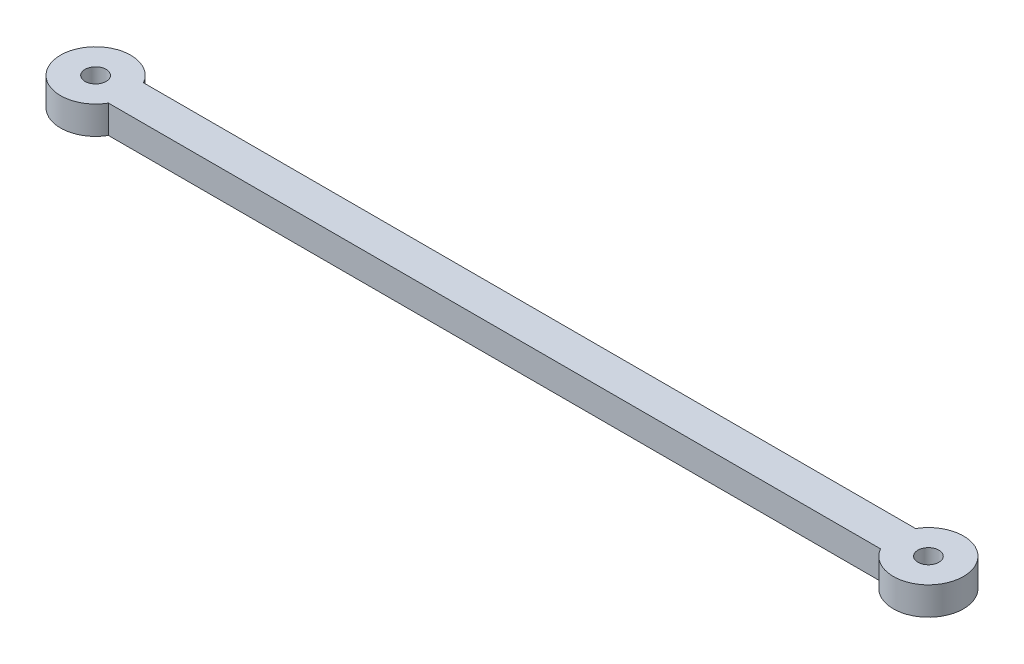
ISO-10303-21;
HEADER;
FILE_DESCRIPTION(('STEP AP214'),'2;1');
FILE_NAME('part.step','',(''),(''),'','','');
FILE_SCHEMA(('AUTOMOTIVE_DESIGN { 1 0 10303 214 1 1 1 1 }'));
ENDSEC;
DATA;
#1=APPLICATION_CONTEXT('core data for automotive mechanical design processes');
#2=APPLICATION_PROTOCOL_DEFINITION('international standard','automotive_design',2000,#1);
#3=PRODUCT_CONTEXT('',#1,'mechanical');
#4=PRODUCT('Part','Part','',(#3));
#5=PRODUCT_RELATED_PRODUCT_CATEGORY('part','',(#4));
#6=PRODUCT_DEFINITION_FORMATION('','',#4);
#7=PRODUCT_DEFINITION_CONTEXT('part definition',#1,'design');
#8=PRODUCT_DEFINITION('design','',#6,#7);
#9=PRODUCT_DEFINITION_SHAPE('','',#8);
#10=(LENGTH_UNIT() NAMED_UNIT(*) SI_UNIT(.MILLI.,.METRE.));
#11=(NAMED_UNIT(*) PLANE_ANGLE_UNIT() SI_UNIT($,.RADIAN.));
#12=(NAMED_UNIT(*) SI_UNIT($,.STERADIAN.) SOLID_ANGLE_UNIT());
#13=UNCERTAINTY_MEASURE_WITH_UNIT(LENGTH_MEASURE(1.E-05),#10,'distance_accuracy_value','');
#14=(GEOMETRIC_REPRESENTATION_CONTEXT(3) GLOBAL_UNCERTAINTY_ASSIGNED_CONTEXT((#13)) GLOBAL_UNIT_ASSIGNED_CONTEXT((#10,
#11,#12)) REPRESENTATION_CONTEXT('',''));
#15=CARTESIAN_POINT('',(0.,0.,0.));
#16=DIRECTION('',(0.,0.,1.));
#17=DIRECTION('',(1.,0.,0.));
#18=AXIS2_PLACEMENT_3D('',#15,#16,#17);
#19=CARTESIAN_POINT('',(-59.3301270189222,4.,0.));
#20=DIRECTION('',(0.,-1.,0.));
#21=DIRECTION('',(0.,0.,-1.));
#22=AXIS2_PLACEMENT_3D('',#19,#20,#21);
#23=CYLINDRICAL_SURFACE('',#22,5.);
#24=CARTESIAN_POINT('',(-59.3301270189222,0.,0.));
#25=DIRECTION('',(0.,1.,0.));
#26=DIRECTION('',(0.,0.,1.));
#27=AXIS2_PLACEMENT_3D('',#24,#25,#26);
#28=CIRCLE('',#27,5.);
#29=CARTESIAN_POINT('',(-55.,0.,-2.5));
#30=VERTEX_POINT('',#29);
#31=CARTESIAN_POINT('',(-55.,0.,2.5));
#32=VERTEX_POINT('',#31);
#33=EDGE_CURVE('E96',#30,#32,#28,.T.);
#34=ORIENTED_EDGE('',*,*,#33,.T.);
#35=DIRECTION('',(0.,-1.,0.));
#36=VECTOR('',#35,1.);
#37=CARTESIAN_POINT('',(-55.,4.,2.5));
#38=LINE('',#37,#36);
#39=CARTESIAN_POINT('',(-55.,4.,2.5));
#40=VERTEX_POINT('',#39);
#41=EDGE_CURVE('E11',#40,#32,#38,.T.);
#42=ORIENTED_EDGE('',*,*,#41,.F.);
#43=CARTESIAN_POINT('',(-59.3301270189222,4.,0.));
#44=DIRECTION('',(0.,1.,0.));
#45=DIRECTION('',(0.,0.,1.));
#46=AXIS2_PLACEMENT_3D('',#43,#44,#45);
#47=CIRCLE('',#46,5.);
#48=CARTESIAN_POINT('',(-55.,4.,-2.5));
#49=VERTEX_POINT('',#48);
#50=EDGE_CURVE('E84',#49,#40,#47,.T.);
#51=ORIENTED_EDGE('',*,*,#50,.F.);
#52=DIRECTION('',(0.,-1.,0.));
#53=VECTOR('',#52,1.);
#54=CARTESIAN_POINT('',(-55.,4.,-2.5));
#55=LINE('',#54,#53);
#56=EDGE_CURVE('E92',#49,#30,#55,.T.);
#57=ORIENTED_EDGE('',*,*,#56,.T.);
#58=EDGE_LOOP('',(#34,#42,#51,#57));
#59=FACE_BOUND('',#58,.T.);
#60=ADVANCED_FACE('F33',(#59),#23,.T.);
#61=CARTESIAN_POINT('',(-55.,4.,2.5));
#62=DIRECTION('',(0.,0.,-1.));
#63=DIRECTION('',(-1.,0.,0.));
#64=AXIS2_PLACEMENT_3D('',#61,#62,#63);
#65=PLANE('',#64);
#66=DIRECTION('',(1.,0.,0.));
#67=VECTOR('',#66,1.);
#68=CARTESIAN_POINT('',(-55.,0.,2.5));
#69=LINE('',#68,#67);
#70=CARTESIAN_POINT('',(55.,0.,2.50000000000001));
#71=VERTEX_POINT('',#70);
#72=EDGE_CURVE('E88',#32,#71,#69,.T.);
#73=ORIENTED_EDGE('',*,*,#72,.T.);
#74=DIRECTION('',(0.,-1.,0.));
#75=VECTOR('',#74,1.);
#76=CARTESIAN_POINT('',(55.,4.,2.50000000000001));
#77=LINE('',#76,#75);
#78=CARTESIAN_POINT('',(55.,4.,2.50000000000001));
#79=VERTEX_POINT('',#78);
#80=EDGE_CURVE('E41',#79,#71,#77,.T.);
#81=ORIENTED_EDGE('',*,*,#80,.F.);
#82=DIRECTION('',(1.,0.,0.));
#83=VECTOR('',#82,1.);
#84=CARTESIAN_POINT('',(-55.,4.,2.5));
#85=LINE('',#84,#83);
#86=EDGE_CURVE('E79',#40,#79,#85,.T.);
#87=ORIENTED_EDGE('',*,*,#86,.F.);
#88=ORIENTED_EDGE('',*,*,#41,.T.);
#89=EDGE_LOOP('',(#73,#81,#87,#88));
#90=FACE_BOUND('',#89,.T.);
#91=ADVANCED_FACE('F87',(#90),#65,.F.);
#92=CARTESIAN_POINT('',(59.3301270189222,4.,0.));
#93=DIRECTION('',(0.,-1.,0.));
#94=DIRECTION('',(0.,0.,-1.));
#95=AXIS2_PLACEMENT_3D('',#92,#93,#94);
#96=CYLINDRICAL_SURFACE('',#95,5.);
#97=CARTESIAN_POINT('',(59.3301270189222,0.,0.));
#98=DIRECTION('',(0.,1.,0.));
#99=DIRECTION('',(0.,0.,-1.));
#100=AXIS2_PLACEMENT_3D('',#97,#98,#99);
#101=CIRCLE('',#100,5.);
#102=CARTESIAN_POINT('',(55.,0.,-2.5));
#103=VERTEX_POINT('',#102);
#104=EDGE_CURVE('E66',#71,#103,#101,.T.);
#105=ORIENTED_EDGE('',*,*,#104,.T.);
#106=DIRECTION('',(0.,-1.,0.));
#107=VECTOR('',#106,1.);
#108=CARTESIAN_POINT('',(55.,4.,-2.5));
#109=LINE('',#108,#107);
#110=CARTESIAN_POINT('',(55.,4.,-2.5));
#111=VERTEX_POINT('',#110);
#112=EDGE_CURVE('E89',#111,#103,#109,.T.);
#113=ORIENTED_EDGE('',*,*,#112,.F.);
#114=CARTESIAN_POINT('',(59.3301270189222,4.,0.));
#115=DIRECTION('',(0.,1.,0.));
#116=DIRECTION('',(0.,0.,-1.));
#117=AXIS2_PLACEMENT_3D('',#114,#115,#116);
#118=CIRCLE('',#117,5.);
#119=EDGE_CURVE('E82',#79,#111,#118,.T.);
#120=ORIENTED_EDGE('',*,*,#119,.F.);
#121=ORIENTED_EDGE('',*,*,#80,.T.);
#122=EDGE_LOOP('',(#105,#113,#120,#121));
#123=FACE_BOUND('',#122,.T.);
#124=ADVANCED_FACE('F90',(#123),#96,.T.);
#125=CARTESIAN_POINT('',(-55.,4.,-2.5));
#126=DIRECTION('',(0.,0.,1.));
#127=DIRECTION('',(1.,0.,0.));
#128=AXIS2_PLACEMENT_3D('',#125,#126,#127);
#129=PLANE('',#128);
#130=DIRECTION('',(-1.,0.,0.));
#131=VECTOR('',#130,1.);
#132=CARTESIAN_POINT('',(-55.,0.,-2.5));
#133=LINE('',#132,#131);
#134=EDGE_CURVE('E72',#103,#30,#133,.T.);
#135=ORIENTED_EDGE('',*,*,#134,.T.);
#136=ORIENTED_EDGE('',*,*,#56,.F.);
#137=DIRECTION('',(-1.,0.,0.));
#138=VECTOR('',#137,1.);
#139=CARTESIAN_POINT('',(-55.,4.,-2.5));
#140=LINE('',#139,#138);
#141=EDGE_CURVE('E49',#111,#49,#140,.T.);
#142=ORIENTED_EDGE('',*,*,#141,.F.);
#143=ORIENTED_EDGE('',*,*,#112,.T.);
#144=EDGE_LOOP('',(#135,#136,#142,#143));
#145=FACE_BOUND('',#144,.T.);
#146=ADVANCED_FACE('F104',(#145),#129,.F.);
#147=CARTESIAN_POINT('',(-59.3301270189222,4.,0.));
#148=DIRECTION('',(0.,1.,0.));
#149=DIRECTION('',(0.,0.,1.));
#150=AXIS2_PLACEMENT_3D('',#147,#148,#149);
#151=PLANE('',#150);
#152=CARTESIAN_POINT('',(-59.3301270189222,4.,0.));
#153=DIRECTION('',(0.,1.,0.));
#154=DIRECTION('',(0.,0.,1.));
#155=AXIS2_PLACEMENT_3D('',#152,#153,#154);
#156=CIRCLE('',#155,1.5);
#157=CARTESIAN_POINT('',(-59.3301270189222,4.,1.5));
#158=VERTEX_POINT('',#157);
#159=EDGE_CURVE('E116',#158,#158,#156,.T.);
#160=ORIENTED_EDGE('',*,*,#159,.F.);
#161=EDGE_LOOP('',(#160));
#162=FACE_BOUND('',#161,.T.);
#163=CARTESIAN_POINT('',(59.3301270189222,4.,0.));
#164=DIRECTION('',(0.,1.,0.));
#165=DIRECTION('',(0.,0.,1.));
#166=AXIS2_PLACEMENT_3D('',#163,#164,#165);
#167=CIRCLE('',#166,1.5);
#168=CARTESIAN_POINT('',(59.3301270189222,4.,1.5));
#169=VERTEX_POINT('',#168);
#170=EDGE_CURVE('E110',#169,#169,#167,.T.);
#171=ORIENTED_EDGE('',*,*,#170,.F.);
#172=EDGE_LOOP('',(#171));
#173=FACE_BOUND('',#172,.T.);
#174=ORIENTED_EDGE('',*,*,#50,.T.);
#175=ORIENTED_EDGE('',*,*,#86,.T.);
#176=ORIENTED_EDGE('',*,*,#119,.T.);
#177=ORIENTED_EDGE('',*,*,#141,.T.);
#178=EDGE_LOOP('',(#174,#175,#176,#177));
#179=FACE_BOUND('',#178,.T.);
#180=ADVANCED_FACE('F80',(#162,#173,#179),#151,.T.);
#181=CARTESIAN_POINT('',(-59.3301270189222,0.,0.));
#182=DIRECTION('',(0.,1.,0.));
#183=DIRECTION('',(0.,0.,1.));
#184=AXIS2_PLACEMENT_3D('',#181,#182,#183);
#185=PLANE('',#184);
#186=CARTESIAN_POINT('',(-59.3301270189222,0.,0.));
#187=DIRECTION('',(0.,1.,0.));
#188=DIRECTION('',(0.,0.,1.));
#189=AXIS2_PLACEMENT_3D('',#186,#187,#188);
#190=CIRCLE('',#189,1.5);
#191=CARTESIAN_POINT('',(-59.3301270189222,0.,1.5));
#192=VERTEX_POINT('',#191);
#193=EDGE_CURVE('E99',#192,#192,#190,.T.);
#194=ORIENTED_EDGE('',*,*,#193,.T.);
#195=EDGE_LOOP('',(#194));
#196=FACE_BOUND('',#195,.T.);
#197=CARTESIAN_POINT('',(59.3301270189222,0.,0.));
#198=DIRECTION('',(0.,1.,0.));
#199=DIRECTION('',(0.,0.,1.));
#200=AXIS2_PLACEMENT_3D('',#197,#198,#199);
#201=CIRCLE('',#200,1.5);
#202=CARTESIAN_POINT('',(59.3301270189222,0.,1.5));
#203=VERTEX_POINT('',#202);
#204=EDGE_CURVE('E113',#203,#203,#201,.T.);
#205=ORIENTED_EDGE('',*,*,#204,.T.);
#206=EDGE_LOOP('',(#205));
#207=FACE_BOUND('',#206,.T.);
#208=ORIENTED_EDGE('',*,*,#33,.F.);
#209=ORIENTED_EDGE('',*,*,#134,.F.);
#210=ORIENTED_EDGE('',*,*,#104,.F.);
#211=ORIENTED_EDGE('',*,*,#72,.F.);
#212=EDGE_LOOP('',(#208,#209,#210,#211));
#213=FACE_BOUND('',#212,.T.);
#214=ADVANCED_FACE('F107',(#196,#207,#213),#185,.F.);
#215=CARTESIAN_POINT('',(59.3301270189222,0.,0.));
#216=DIRECTION('',(0.,1.,0.));
#217=DIRECTION('',(0.,0.,1.));
#218=AXIS2_PLACEMENT_3D('',#215,#216,#217);
#219=CYLINDRICAL_SURFACE('',#218,1.5);
#220=ORIENTED_EDGE('',*,*,#204,.F.);
#221=EDGE_LOOP('',(#220));
#222=FACE_BOUND('',#221,.T.);
#223=ORIENTED_EDGE('',*,*,#170,.T.);
#224=EDGE_LOOP('',(#223));
#225=FACE_BOUND('',#224,.T.);
#226=ADVANCED_FACE('F127',(#222,#225),#219,.F.);
#227=CARTESIAN_POINT('',(-59.3301270189222,0.,0.));
#228=DIRECTION('',(0.,1.,0.));
#229=DIRECTION('',(0.,0.,1.));
#230=AXIS2_PLACEMENT_3D('',#227,#228,#229);
#231=CYLINDRICAL_SURFACE('',#230,1.5);
#232=ORIENTED_EDGE('',*,*,#193,.F.);
#233=EDGE_LOOP('',(#232));
#234=FACE_BOUND('',#233,.T.);
#235=ORIENTED_EDGE('',*,*,#159,.T.);
#236=EDGE_LOOP('',(#235));
#237=FACE_BOUND('',#236,.T.);
#238=ADVANCED_FACE('F124',(#234,#237),#231,.F.);
#239=CLOSED_SHELL('',(#60,#91,#124,#146,#180,#214,#226,#238));
#240=MANIFOLD_SOLID_BREP('B2',#239);
#241=ADVANCED_BREP_SHAPE_REPRESENTATION('',(#18,#240),#14);
#242=SHAPE_DEFINITION_REPRESENTATION(#9,#241);
ENDSEC;
END-ISO-10303-21;
